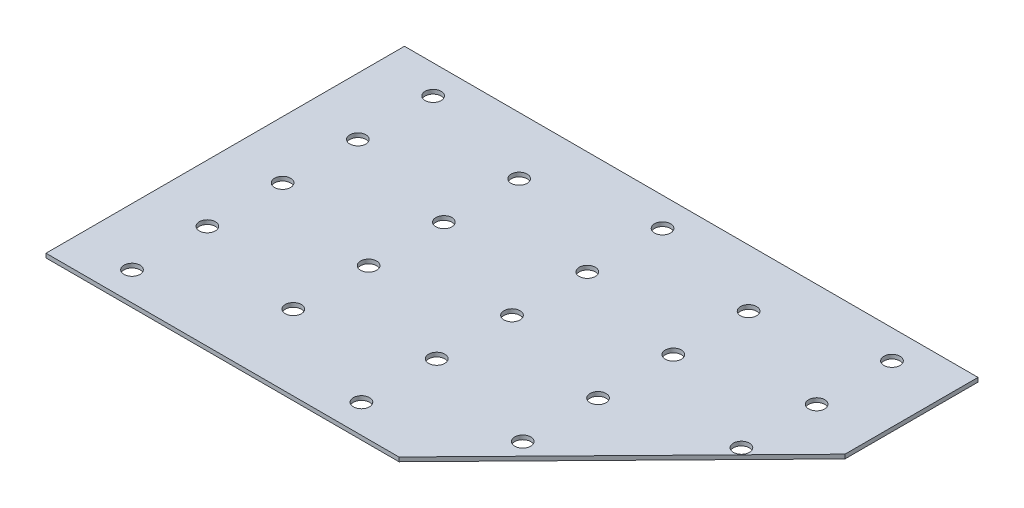
ISO-10303-21;
HEADER;
FILE_DESCRIPTION(('STEP AP214'),'2;1');
FILE_NAME('part.step','',(''),(''),'','','');
FILE_SCHEMA(('AUTOMOTIVE_DESIGN { 1 0 10303 214 1 1 1 1 }'));
ENDSEC;
DATA;
#1=APPLICATION_CONTEXT('core data for automotive mechanical design processes');
#2=APPLICATION_PROTOCOL_DEFINITION('international standard','automotive_design',2000,#1);
#3=PRODUCT_CONTEXT('',#1,'mechanical');
#4=PRODUCT('Part','Part','',(#3));
#5=PRODUCT_RELATED_PRODUCT_CATEGORY('part','',(#4));
#6=PRODUCT_DEFINITION_FORMATION('','',#4);
#7=PRODUCT_DEFINITION_CONTEXT('part definition',#1,'design');
#8=PRODUCT_DEFINITION('design','',#6,#7);
#9=PRODUCT_DEFINITION_SHAPE('','',#8);
#10=(LENGTH_UNIT() NAMED_UNIT(*) SI_UNIT(.MILLI.,.METRE.));
#11=(NAMED_UNIT(*) PLANE_ANGLE_UNIT() SI_UNIT($,.RADIAN.));
#12=(NAMED_UNIT(*) SI_UNIT($,.STERADIAN.) SOLID_ANGLE_UNIT());
#13=UNCERTAINTY_MEASURE_WITH_UNIT(LENGTH_MEASURE(1.E-05),#10,'distance_accuracy_value','');
#14=(GEOMETRIC_REPRESENTATION_CONTEXT(3) GLOBAL_UNCERTAINTY_ASSIGNED_CONTEXT((#13)) GLOBAL_UNIT_ASSIGNED_CONTEXT((#10,
#11,#12)) REPRESENTATION_CONTEXT('',''));
#15=CARTESIAN_POINT('',(0.,0.,0.));
#16=DIRECTION('',(0.,0.,1.));
#17=DIRECTION('',(1.,0.,0.));
#18=AXIS2_PLACEMENT_3D('',#15,#16,#17);
#19=CARTESIAN_POINT('',(0.,0.9144,0.));
#20=DIRECTION('',(0.,1.,0.));
#21=DIRECTION('',(0.,0.,1.));
#22=AXIS2_PLACEMENT_3D('',#19,#20,#21);
#23=PLANE('',#22);
#24=CARTESIAN_POINT('',(-50.8,0.9144,-33.3375));
#25=DIRECTION('',(0.,1.,0.));
#26=DIRECTION('',(0.,0.,1.));
#27=AXIS2_PLACEMENT_3D('',#24,#25,#26);
#28=CIRCLE('',#27,1.778);
#29=CARTESIAN_POINT('',(-50.8,0.9144,-31.5595));
#30=VERTEX_POINT('',#29);
#31=EDGE_CURVE('E150',#30,#30,#28,.F.);
#32=ORIENTED_EDGE('',*,*,#31,.T.);
#33=EDGE_LOOP('',(#32));
#34=FACE_BOUND('',#33,.T.);
#35=CARTESIAN_POINT('',(25.4,0.9144,23.01875));
#36=DIRECTION('',(0.,1.,0.));
#37=DIRECTION('',(0.,0.,1.));
#38=AXIS2_PLACEMENT_3D('',#35,#36,#37);
#39=CIRCLE('',#38,1.778);
#40=CARTESIAN_POINT('',(25.4,0.9144,24.79675));
#41=VERTEX_POINT('',#40);
#42=EDGE_CURVE('E153',#41,#41,#39,.F.);
#43=ORIENTED_EDGE('',*,*,#42,.T.);
#44=EDGE_LOOP('',(#43));
#45=FACE_BOUND('',#44,.T.);
#46=CARTESIAN_POINT('',(-25.4,0.9144,23.01875));
#47=DIRECTION('',(0.,1.,0.));
#48=DIRECTION('',(0.,0.,1.));
#49=AXIS2_PLACEMENT_3D('',#46,#47,#48);
#50=CIRCLE('',#49,1.778);
#51=CARTESIAN_POINT('',(-25.4,0.9144,24.79675));
#52=VERTEX_POINT('',#51);
#53=EDGE_CURVE('E156',#52,#52,#50,.F.);
#54=ORIENTED_EDGE('',*,*,#53,.T.);
#55=EDGE_LOOP('',(#54));
#56=FACE_BOUND('',#55,.T.);
#57=CARTESIAN_POINT('',(25.4,0.9144,6.35));
#58=DIRECTION('',(0.,1.,0.));
#59=DIRECTION('',(0.,0.,1.));
#60=AXIS2_PLACEMENT_3D('',#57,#58,#59);
#61=CIRCLE('',#60,1.778);
#62=CARTESIAN_POINT('',(25.4,0.9144,8.128));
#63=VERTEX_POINT('',#62);
#64=EDGE_CURVE('E159',#63,#63,#61,.F.);
#65=ORIENTED_EDGE('',*,*,#64,.T.);
#66=EDGE_LOOP('',(#65));
#67=FACE_BOUND('',#66,.T.);
#68=CARTESIAN_POINT('',(-25.4,0.9144,6.35));
#69=DIRECTION('',(0.,1.,0.));
#70=DIRECTION('',(0.,0.,1.));
#71=AXIS2_PLACEMENT_3D('',#68,#69,#70);
#72=CIRCLE('',#71,1.778);
#73=CARTESIAN_POINT('',(-25.4,0.9144,8.128));
#74=VERTEX_POINT('',#73);
#75=EDGE_CURVE('E162',#74,#74,#72,.F.);
#76=ORIENTED_EDGE('',*,*,#75,.T.);
#77=EDGE_LOOP('',(#76));
#78=FACE_BOUND('',#77,.T.);
#79=CARTESIAN_POINT('',(25.4,0.9144,-10.31875));
#80=DIRECTION('',(0.,1.,0.));
#81=DIRECTION('',(0.,0.,1.));
#82=AXIS2_PLACEMENT_3D('',#79,#80,#81);
#83=CIRCLE('',#82,1.778);
#84=CARTESIAN_POINT('',(25.4,0.9144,-8.54075));
#85=VERTEX_POINT('',#84);
#86=EDGE_CURVE('E165',#85,#85,#83,.F.);
#87=ORIENTED_EDGE('',*,*,#86,.T.);
#88=EDGE_LOOP('',(#87));
#89=FACE_BOUND('',#88,.T.);
#90=CARTESIAN_POINT('',(-25.4,0.9144,-10.31875));
#91=DIRECTION('',(0.,1.,0.));
#92=DIRECTION('',(0.,0.,1.));
#93=AXIS2_PLACEMENT_3D('',#90,#91,#92);
#94=CIRCLE('',#93,1.778);
#95=CARTESIAN_POINT('',(-25.4,0.9144,-8.54075));
#96=VERTEX_POINT('',#95);
#97=EDGE_CURVE('E168',#96,#96,#94,.F.);
#98=ORIENTED_EDGE('',*,*,#97,.T.);
#99=EDGE_LOOP('',(#98));
#100=FACE_BOUND('',#99,.T.);
#101=CARTESIAN_POINT('',(25.4,0.9144,-26.9875));
#102=DIRECTION('',(0.,1.,0.));
#103=DIRECTION('',(0.,0.,1.));
#104=AXIS2_PLACEMENT_3D('',#101,#102,#103);
#105=CIRCLE('',#104,1.778);
#106=CARTESIAN_POINT('',(25.4,0.9144,-25.2095));
#107=VERTEX_POINT('',#106);
#108=EDGE_CURVE('E171',#107,#107,#105,.F.);
#109=ORIENTED_EDGE('',*,*,#108,.T.);
#110=EDGE_LOOP('',(#109));
#111=FACE_BOUND('',#110,.T.);
#112=CARTESIAN_POINT('',(-25.4,0.9144,-26.9875));
#113=DIRECTION('',(0.,1.,0.));
#114=DIRECTION('',(0.,0.,1.));
#115=AXIS2_PLACEMENT_3D('',#112,#113,#114);
#116=CIRCLE('',#115,1.778);
#117=CARTESIAN_POINT('',(-25.4,0.9144,-25.2095));
#118=VERTEX_POINT('',#117);
#119=EDGE_CURVE('E174',#118,#118,#116,.F.);
#120=ORIENTED_EDGE('',*,*,#119,.T.);
#121=EDGE_LOOP('',(#120));
#122=FACE_BOUND('',#121,.T.);
#123=CARTESIAN_POINT('',(0.,0.9144,33.3375));
#124=DIRECTION('',(0.,1.,0.));
#125=DIRECTION('',(0.,0.,1.));
#126=AXIS2_PLACEMENT_3D('',#123,#124,#125);
#127=CIRCLE('',#126,1.778);
#128=CARTESIAN_POINT('',(0.,0.9144,35.1155));
#129=VERTEX_POINT('',#128);
#130=EDGE_CURVE('E177',#129,#129,#127,.F.);
#131=ORIENTED_EDGE('',*,*,#130,.T.);
#132=EDGE_LOOP('',(#131));
#133=FACE_BOUND('',#132,.T.);
#134=CARTESIAN_POINT('',(-50.8,0.9144,33.3375));
#135=DIRECTION('',(0.,1.,0.));
#136=DIRECTION('',(0.,0.,1.));
#137=AXIS2_PLACEMENT_3D('',#134,#135,#136);
#138=CIRCLE('',#137,1.778);
#139=CARTESIAN_POINT('',(-50.8,0.9144,35.1155));
#140=VERTEX_POINT('',#139);
#141=EDGE_CURVE('E180',#140,#140,#138,.F.);
#142=ORIENTED_EDGE('',*,*,#141,.T.);
#143=EDGE_LOOP('',(#142));
#144=FACE_BOUND('',#143,.T.);
#145=CARTESIAN_POINT('',(0.,0.9144,16.66875));
#146=DIRECTION('',(0.,1.,0.));
#147=DIRECTION('',(0.,0.,1.));
#148=AXIS2_PLACEMENT_3D('',#145,#146,#147);
#149=CIRCLE('',#148,1.778);
#150=CARTESIAN_POINT('',(0.,0.9144,18.44675));
#151=VERTEX_POINT('',#150);
#152=EDGE_CURVE('E183',#151,#151,#149,.F.);
#153=ORIENTED_EDGE('',*,*,#152,.T.);
#154=EDGE_LOOP('',(#153));
#155=FACE_BOUND('',#154,.T.);
#156=CARTESIAN_POINT('',(-50.8,0.9144,16.66875));
#157=DIRECTION('',(0.,1.,0.));
#158=DIRECTION('',(0.,0.,1.));
#159=AXIS2_PLACEMENT_3D('',#156,#157,#158);
#160=CIRCLE('',#159,1.778);
#161=CARTESIAN_POINT('',(-50.8,0.9144,18.44675));
#162=VERTEX_POINT('',#161);
#163=EDGE_CURVE('E186',#162,#162,#160,.F.);
#164=ORIENTED_EDGE('',*,*,#163,.T.);
#165=EDGE_LOOP('',(#164));
#166=FACE_BOUND('',#165,.T.);
#167=CARTESIAN_POINT('',(50.8,0.9144,0.));
#168=DIRECTION('',(0.,1.,0.));
#169=DIRECTION('',(0.,0.,1.));
#170=AXIS2_PLACEMENT_3D('',#167,#168,#169);
#171=CIRCLE('',#170,1.778);
#172=CARTESIAN_POINT('',(50.8,0.9144,1.778));
#173=VERTEX_POINT('',#172);
#174=EDGE_CURVE('E189',#173,#173,#171,.F.);
#175=ORIENTED_EDGE('',*,*,#174,.T.);
#176=EDGE_LOOP('',(#175));
#177=FACE_BOUND('',#176,.T.);
#178=CARTESIAN_POINT('',(0.,0.9144,0.));
#179=DIRECTION('',(0.,1.,0.));
#180=DIRECTION('',(0.,0.,1.));
#181=AXIS2_PLACEMENT_3D('',#178,#179,#180);
#182=CIRCLE('',#181,1.778);
#183=CARTESIAN_POINT('',(0.,0.9144,1.778));
#184=VERTEX_POINT('',#183);
#185=EDGE_CURVE('E192',#184,#184,#182,.F.);
#186=ORIENTED_EDGE('',*,*,#185,.T.);
#187=EDGE_LOOP('',(#186));
#188=FACE_BOUND('',#187,.T.);
#189=CARTESIAN_POINT('',(-50.8,0.9144,0.));
#190=DIRECTION('',(0.,1.,0.));
#191=DIRECTION('',(0.,0.,1.));
#192=AXIS2_PLACEMENT_3D('',#189,#190,#191);
#193=CIRCLE('',#192,1.778);
#194=CARTESIAN_POINT('',(-50.8,0.9144,1.778));
#195=VERTEX_POINT('',#194);
#196=EDGE_CURVE('E195',#195,#195,#193,.F.);
#197=ORIENTED_EDGE('',*,*,#196,.T.);
#198=EDGE_LOOP('',(#197));
#199=FACE_BOUND('',#198,.T.);
#200=CARTESIAN_POINT('',(50.8,0.9144,-16.66875));
#201=DIRECTION('',(0.,1.,0.));
#202=DIRECTION('',(0.,0.,1.));
#203=AXIS2_PLACEMENT_3D('',#200,#201,#202);
#204=CIRCLE('',#203,1.778);
#205=CARTESIAN_POINT('',(50.8,0.9144,-14.89075));
#206=VERTEX_POINT('',#205);
#207=EDGE_CURVE('E198',#206,#206,#204,.F.);
#208=ORIENTED_EDGE('',*,*,#207,.T.);
#209=EDGE_LOOP('',(#208));
#210=FACE_BOUND('',#209,.T.);
#211=CARTESIAN_POINT('',(0.,0.9144,-16.66875));
#212=DIRECTION('',(0.,1.,0.));
#213=DIRECTION('',(0.,0.,1.));
#214=AXIS2_PLACEMENT_3D('',#211,#212,#213);
#215=CIRCLE('',#214,1.778);
#216=CARTESIAN_POINT('',(0.,0.9144,-14.89075));
#217=VERTEX_POINT('',#216);
#218=EDGE_CURVE('E201',#217,#217,#215,.F.);
#219=ORIENTED_EDGE('',*,*,#218,.T.);
#220=EDGE_LOOP('',(#219));
#221=FACE_BOUND('',#220,.T.);
#222=CARTESIAN_POINT('',(-50.8,0.9144,-16.66875));
#223=DIRECTION('',(0.,1.,0.));
#224=DIRECTION('',(0.,0.,1.));
#225=AXIS2_PLACEMENT_3D('',#222,#223,#224);
#226=CIRCLE('',#225,1.778);
#227=CARTESIAN_POINT('',(-50.8,0.9144,-14.89075));
#228=VERTEX_POINT('',#227);
#229=EDGE_CURVE('E204',#228,#228,#226,.F.);
#230=ORIENTED_EDGE('',*,*,#229,.T.);
#231=EDGE_LOOP('',(#230));
#232=FACE_BOUND('',#231,.T.);
#233=CARTESIAN_POINT('',(50.8,0.9144,-33.3375));
#234=DIRECTION('',(0.,1.,0.));
#235=DIRECTION('',(0.,0.,1.));
#236=AXIS2_PLACEMENT_3D('',#233,#234,#235);
#237=CIRCLE('',#236,1.778);
#238=CARTESIAN_POINT('',(50.8,0.9144,-31.5595));
#239=VERTEX_POINT('',#238);
#240=EDGE_CURVE('E206',#239,#239,#237,.F.);
#241=ORIENTED_EDGE('',*,*,#240,.T.);
#242=EDGE_LOOP('',(#241));
#243=FACE_BOUND('',#242,.T.);
#244=CARTESIAN_POINT('',(0.,0.9144,-33.3375));
#245=DIRECTION('',(0.,1.,0.));
#246=DIRECTION('',(0.,0.,1.));
#247=AXIS2_PLACEMENT_3D('',#244,#245,#246);
#248=CIRCLE('',#247,1.778);
#249=CARTESIAN_POINT('',(0.,0.9144,-31.5595));
#250=VERTEX_POINT('',#249);
#251=EDGE_CURVE('E19',#250,#250,#248,.F.);
#252=ORIENTED_EDGE('',*,*,#251,.T.);
#253=EDGE_LOOP('',(#252));
#254=FACE_BOUND('',#253,.T.);
#255=DIRECTION('',(1.,0.,0.));
#256=VECTOR('',#255,1.);
#257=CARTESIAN_POINT('',(-63.5,0.9144,39.6875));
#258=LINE('',#257,#256);
#259=CARTESIAN_POINT('',(14.659600288689,0.9144,39.6875000000005));
#260=VERTEX_POINT('',#259);
#261=CARTESIAN_POINT('',(-63.5,0.9144,39.6875));
#262=VERTEX_POINT('',#261);
#263=EDGE_CURVE('E78',#260,#262,#258,.F.);
#264=ORIENTED_EDGE('',*,*,#263,.F.);
#265=DIRECTION('',(-0.699281733504182,0.,0.714846177290882));
#266=VECTOR('',#265,1.);
#267=CARTESIAN_POINT('',(63.5,0.9144,-10.2399775218734));
#268=LINE('',#267,#266);
#269=CARTESIAN_POINT('',(63.5,0.9144,-10.2399775218734));
#270=VERTEX_POINT('',#269);
#271=EDGE_CURVE('E74',#260,#270,#268,.F.);
#272=ORIENTED_EDGE('',*,*,#271,.T.);
#273=DIRECTION('',(0.,0.,-1.));
#274=VECTOR('',#273,1.);
#275=CARTESIAN_POINT('',(63.5,0.9144,39.6875));
#276=LINE('',#275,#274);
#277=CARTESIAN_POINT('',(63.5,0.9144,-39.6875));
#278=VERTEX_POINT('',#277);
#279=EDGE_CURVE('E65',#278,#270,#276,.F.);
#280=ORIENTED_EDGE('',*,*,#279,.F.);
#281=DIRECTION('',(-1.,0.,0.));
#282=VECTOR('',#281,1.);
#283=CARTESIAN_POINT('',(63.5,0.9144,-39.6875));
#284=LINE('',#283,#282);
#285=CARTESIAN_POINT('',(-63.5,0.9144,-39.6875));
#286=VERTEX_POINT('',#285);
#287=EDGE_CURVE('E60',#286,#278,#284,.F.);
#288=ORIENTED_EDGE('',*,*,#287,.F.);
#289=DIRECTION('',(0.,0.,1.));
#290=VECTOR('',#289,1.);
#291=CARTESIAN_POINT('',(-63.5,0.9144,-39.6875));
#292=LINE('',#291,#290);
#293=EDGE_CURVE('E222',#262,#286,#292,.F.);
#294=ORIENTED_EDGE('',*,*,#293,.F.);
#295=EDGE_LOOP('',(#264,#272,#280,#288,#294));
#296=FACE_BOUND('',#295,.T.);
#297=ADVANCED_FACE('F16',(#34,#45,#56,#67,#78,#89,#100,#111,#122,#133,#144,#155,#166,#177,#188,
#199,#210,#221,#232,#243,#254,#296),#23,.T.);
#298=CARTESIAN_POINT('',(63.5,0.9144,-10.2399775218734));
#299=DIRECTION('',(-0.714846177290882,0.,-0.699281733504182));
#300=DIRECTION('',(-0.699281733504182,0.,0.714846177290882));
#301=AXIS2_PLACEMENT_3D('',#298,#299,#300);
#302=PLANE('',#301);
#303=ORIENTED_EDGE('',*,*,#271,.F.);
#304=DIRECTION('',(0.,1.,0.));
#305=VECTOR('',#304,1.);
#306=CARTESIAN_POINT('',(14.6596002886885,0.,39.6875));
#307=LINE('',#306,#305);
#308=CARTESIAN_POINT('',(14.6596002886895,0.,39.6875000000011));
#309=VERTEX_POINT('',#308);
#310=EDGE_CURVE('E211',#309,#260,#307,.T.);
#311=ORIENTED_EDGE('',*,*,#310,.F.);
#312=DIRECTION('',(0.699281733504213,0.,-0.714846177290851));
#313=VECTOR('',#312,1.);
#314=CARTESIAN_POINT('',(14.6596002886885,0.,39.6875));
#315=LINE('',#314,#313);
#316=CARTESIAN_POINT('',(63.5,0.,-10.2399775218734));
#317=VERTEX_POINT('',#316);
#318=EDGE_CURVE('E85',#309,#317,#315,.T.);
#319=ORIENTED_EDGE('',*,*,#318,.T.);
#320=DIRECTION('',(0.,1.,0.));
#321=VECTOR('',#320,1.);
#322=CARTESIAN_POINT('',(63.5,0.,-10.2399775218734));
#323=LINE('',#322,#321);
#324=EDGE_CURVE('E70',#270,#317,#323,.F.);
#325=ORIENTED_EDGE('',*,*,#324,.F.);
#326=EDGE_LOOP('',(#303,#311,#319,#325));
#327=FACE_BOUND('',#326,.T.);
#328=ADVANCED_FACE('F84',(#327),#302,.F.);
#329=CARTESIAN_POINT('',(63.5,0.,39.6875));
#330=DIRECTION('',(1.,0.,0.));
#331=DIRECTION('',(0.,0.,-1.));
#332=AXIS2_PLACEMENT_3D('',#329,#330,#331);
#333=PLANE('',#332);
#334=ORIENTED_EDGE('',*,*,#279,.T.);
#335=ORIENTED_EDGE('',*,*,#324,.T.);
#336=DIRECTION('',(0.,0.,1.));
#337=VECTOR('',#336,1.);
#338=CARTESIAN_POINT('',(63.5,0.,0.));
#339=LINE('',#338,#337);
#340=CARTESIAN_POINT('',(63.5,0.,-39.6875));
#341=VERTEX_POINT('',#340);
#342=EDGE_CURVE('E230',#317,#341,#339,.F.);
#343=ORIENTED_EDGE('',*,*,#342,.T.);
#344=DIRECTION('',(0.,1.,0.));
#345=VECTOR('',#344,1.);
#346=CARTESIAN_POINT('',(63.5,0.,-39.6875));
#347=LINE('',#346,#345);
#348=EDGE_CURVE('E72',#278,#341,#347,.F.);
#349=ORIENTED_EDGE('',*,*,#348,.F.);
#350=EDGE_LOOP('',(#334,#335,#343,#349));
#351=FACE_BOUND('',#350,.T.);
#352=ADVANCED_FACE('F67',(#351),#333,.T.);
#353=CARTESIAN_POINT('',(63.5,0.,-39.6875));
#354=DIRECTION('',(0.,0.,-1.));
#355=DIRECTION('',(-1.,0.,0.));
#356=AXIS2_PLACEMENT_3D('',#353,#354,#355);
#357=PLANE('',#356);
#358=ORIENTED_EDGE('',*,*,#348,.T.);
#359=DIRECTION('',(1.,0.,0.));
#360=VECTOR('',#359,1.);
#361=CARTESIAN_POINT('',(0.,0.,-39.6875));
#362=LINE('',#361,#360);
#363=CARTESIAN_POINT('',(-63.5,0.,-39.6875));
#364=VERTEX_POINT('',#363);
#365=EDGE_CURVE('E226',#341,#364,#362,.F.);
#366=ORIENTED_EDGE('',*,*,#365,.T.);
#367=DIRECTION('',(0.,1.,0.));
#368=VECTOR('',#367,1.);
#369=CARTESIAN_POINT('',(-63.5,0.,-39.6875));
#370=LINE('',#369,#368);
#371=EDGE_CURVE('E220',#286,#364,#370,.F.);
#372=ORIENTED_EDGE('',*,*,#371,.F.);
#373=ORIENTED_EDGE('',*,*,#287,.T.);
#374=EDGE_LOOP('',(#358,#366,#372,#373));
#375=FACE_BOUND('',#374,.T.);
#376=ADVANCED_FACE('F225',(#375),#357,.T.);
#377=CARTESIAN_POINT('',(-63.5,0.,-39.6875));
#378=DIRECTION('',(-1.,0.,0.));
#379=DIRECTION('',(0.,0.,1.));
#380=AXIS2_PLACEMENT_3D('',#377,#378,#379);
#381=PLANE('',#380);
#382=ORIENTED_EDGE('',*,*,#371,.T.);
#383=DIRECTION('',(0.,0.,1.));
#384=VECTOR('',#383,1.);
#385=CARTESIAN_POINT('',(-63.5,0.,0.));
#386=LINE('',#385,#384);
#387=CARTESIAN_POINT('',(-63.5,0.,39.6875));
#388=VERTEX_POINT('',#387);
#389=EDGE_CURVE('E232',#364,#388,#386,.T.);
#390=ORIENTED_EDGE('',*,*,#389,.T.);
#391=DIRECTION('',(0.,1.,0.));
#392=VECTOR('',#391,1.);
#393=CARTESIAN_POINT('',(-63.5,0.,39.6875));
#394=LINE('',#393,#392);
#395=EDGE_CURVE('E34',#262,#388,#394,.F.);
#396=ORIENTED_EDGE('',*,*,#395,.F.);
#397=ORIENTED_EDGE('',*,*,#293,.T.);
#398=EDGE_LOOP('',(#382,#390,#396,#397));
#399=FACE_BOUND('',#398,.T.);
#400=ADVANCED_FACE('F238',(#399),#381,.T.);
#401=CARTESIAN_POINT('',(-63.5,0.,39.6875));
#402=DIRECTION('',(0.,0.,1.));
#403=DIRECTION('',(1.,0.,0.));
#404=AXIS2_PLACEMENT_3D('',#401,#402,#403);
#405=PLANE('',#404);
#406=DIRECTION('',(1.,0.,0.));
#407=VECTOR('',#406,1.);
#408=CARTESIAN_POINT('',(0.,0.,39.6875));
#409=LINE('',#408,#407);
#410=EDGE_CURVE('E149',#388,#309,#409,.T.);
#411=ORIENTED_EDGE('',*,*,#410,.T.);
#412=ORIENTED_EDGE('',*,*,#310,.T.);
#413=ORIENTED_EDGE('',*,*,#263,.T.);
#414=ORIENTED_EDGE('',*,*,#395,.T.);
#415=EDGE_LOOP('',(#411,#412,#413,#414));
#416=FACE_BOUND('',#415,.T.);
#417=ADVANCED_FACE('F236',(#416),#405,.T.);
#418=CARTESIAN_POINT('',(0.,0.9144,-33.3375));
#419=DIRECTION('',(0.,1.,0.));
#420=DIRECTION('',(0.,0.,1.));
#421=AXIS2_PLACEMENT_3D('',#418,#419,#420);
#422=CYLINDRICAL_SURFACE('',#421,1.778);
#423=ORIENTED_EDGE('',*,*,#251,.F.);
#424=EDGE_LOOP('',(#423));
#425=FACE_BOUND('',#424,.T.);
#426=CARTESIAN_POINT('',(0.,0.,-33.3375));
#427=DIRECTION('',(0.,1.,0.));
#428=DIRECTION('',(0.,0.,1.));
#429=AXIS2_PLACEMENT_3D('',#426,#427,#428);
#430=CIRCLE('',#429,1.778);
#431=CARTESIAN_POINT('',(0.,0.,-31.5595));
#432=VERTEX_POINT('',#431);
#433=EDGE_CURVE('E146',#432,#432,#430,.F.);
#434=ORIENTED_EDGE('',*,*,#433,.T.);
#435=EDGE_LOOP('',(#434));
#436=FACE_BOUND('',#435,.T.);
#437=ADVANCED_FACE('F246',(#425,#436),#422,.F.);
#438=CARTESIAN_POINT('',(50.8,0.9144,-33.3375));
#439=DIRECTION('',(0.,1.,0.));
#440=DIRECTION('',(0.,0.,1.));
#441=AXIS2_PLACEMENT_3D('',#438,#439,#440);
#442=CYLINDRICAL_SURFACE('',#441,1.778);
#443=ORIENTED_EDGE('',*,*,#240,.F.);
#444=EDGE_LOOP('',(#443));
#445=FACE_BOUND('',#444,.T.);
#446=CARTESIAN_POINT('',(50.8,0.,-33.3375));
#447=DIRECTION('',(0.,1.,0.));
#448=DIRECTION('',(0.,0.,1.));
#449=AXIS2_PLACEMENT_3D('',#446,#447,#448);
#450=CIRCLE('',#449,1.778);
#451=CARTESIAN_POINT('',(50.8,0.,-31.5595));
#452=VERTEX_POINT('',#451);
#453=EDGE_CURVE('E143',#452,#452,#450,.F.);
#454=ORIENTED_EDGE('',*,*,#453,.T.);
#455=EDGE_LOOP('',(#454));
#456=FACE_BOUND('',#455,.T.);
#457=ADVANCED_FACE('F332',(#445,#456),#442,.F.);
#458=CARTESIAN_POINT('',(-50.8,0.9144,-16.66875));
#459=DIRECTION('',(0.,1.,0.));
#460=DIRECTION('',(0.,0.,1.));
#461=AXIS2_PLACEMENT_3D('',#458,#459,#460);
#462=CYLINDRICAL_SURFACE('',#461,1.778);
#463=ORIENTED_EDGE('',*,*,#229,.F.);
#464=EDGE_LOOP('',(#463));
#465=FACE_BOUND('',#464,.T.);
#466=CARTESIAN_POINT('',(-50.8,0.,-16.66875));
#467=DIRECTION('',(0.,1.,0.));
#468=DIRECTION('',(0.,0.,1.));
#469=AXIS2_PLACEMENT_3D('',#466,#467,#468);
#470=CIRCLE('',#469,1.778);
#471=CARTESIAN_POINT('',(-50.8,0.,-14.89075));
#472=VERTEX_POINT('',#471);
#473=EDGE_CURVE('E140',#472,#472,#470,.F.);
#474=ORIENTED_EDGE('',*,*,#473,.T.);
#475=EDGE_LOOP('',(#474));
#476=FACE_BOUND('',#475,.T.);
#477=ADVANCED_FACE('F328',(#465,#476),#462,.F.);
#478=CARTESIAN_POINT('',(0.,0.9144,-16.66875));
#479=DIRECTION('',(0.,1.,0.));
#480=DIRECTION('',(0.,0.,1.));
#481=AXIS2_PLACEMENT_3D('',#478,#479,#480);
#482=CYLINDRICAL_SURFACE('',#481,1.778);
#483=ORIENTED_EDGE('',*,*,#218,.F.);
#484=EDGE_LOOP('',(#483));
#485=FACE_BOUND('',#484,.T.);
#486=CARTESIAN_POINT('',(0.,0.,-16.66875));
#487=DIRECTION('',(0.,1.,0.));
#488=DIRECTION('',(0.,0.,1.));
#489=AXIS2_PLACEMENT_3D('',#486,#487,#488);
#490=CIRCLE('',#489,1.778);
#491=CARTESIAN_POINT('',(0.,0.,-14.89075));
#492=VERTEX_POINT('',#491);
#493=EDGE_CURVE('E137',#492,#492,#490,.F.);
#494=ORIENTED_EDGE('',*,*,#493,.T.);
#495=EDGE_LOOP('',(#494));
#496=FACE_BOUND('',#495,.T.);
#497=ADVANCED_FACE('F324',(#485,#496),#482,.F.);
#498=CARTESIAN_POINT('',(50.8,0.9144,-16.66875));
#499=DIRECTION('',(0.,1.,0.));
#500=DIRECTION('',(0.,0.,1.));
#501=AXIS2_PLACEMENT_3D('',#498,#499,#500);
#502=CYLINDRICAL_SURFACE('',#501,1.778);
#503=ORIENTED_EDGE('',*,*,#207,.F.);
#504=EDGE_LOOP('',(#503));
#505=FACE_BOUND('',#504,.T.);
#506=CARTESIAN_POINT('',(50.8,0.,-16.66875));
#507=DIRECTION('',(0.,1.,0.));
#508=DIRECTION('',(0.,0.,1.));
#509=AXIS2_PLACEMENT_3D('',#506,#507,#508);
#510=CIRCLE('',#509,1.778);
#511=CARTESIAN_POINT('',(50.8,0.,-14.89075));
#512=VERTEX_POINT('',#511);
#513=EDGE_CURVE('E134',#512,#512,#510,.F.);
#514=ORIENTED_EDGE('',*,*,#513,.T.);
#515=EDGE_LOOP('',(#514));
#516=FACE_BOUND('',#515,.T.);
#517=ADVANCED_FACE('F320',(#505,#516),#502,.F.);
#518=CARTESIAN_POINT('',(-50.8,0.9144,0.));
#519=DIRECTION('',(0.,1.,0.));
#520=DIRECTION('',(0.,0.,1.));
#521=AXIS2_PLACEMENT_3D('',#518,#519,#520);
#522=CYLINDRICAL_SURFACE('',#521,1.778);
#523=ORIENTED_EDGE('',*,*,#196,.F.);
#524=EDGE_LOOP('',(#523));
#525=FACE_BOUND('',#524,.T.);
#526=CARTESIAN_POINT('',(-50.8,0.,0.));
#527=DIRECTION('',(0.,1.,0.));
#528=DIRECTION('',(0.,0.,1.));
#529=AXIS2_PLACEMENT_3D('',#526,#527,#528);
#530=CIRCLE('',#529,1.778);
#531=CARTESIAN_POINT('',(-50.8,0.,1.778));
#532=VERTEX_POINT('',#531);
#533=EDGE_CURVE('E131',#532,#532,#530,.F.);
#534=ORIENTED_EDGE('',*,*,#533,.T.);
#535=EDGE_LOOP('',(#534));
#536=FACE_BOUND('',#535,.T.);
#537=ADVANCED_FACE('F316',(#525,#536),#522,.F.);
#538=CARTESIAN_POINT('',(0.,0.9144,0.));
#539=DIRECTION('',(0.,1.,0.));
#540=DIRECTION('',(0.,0.,1.));
#541=AXIS2_PLACEMENT_3D('',#538,#539,#540);
#542=CYLINDRICAL_SURFACE('',#541,1.778);
#543=ORIENTED_EDGE('',*,*,#185,.F.);
#544=EDGE_LOOP('',(#543));
#545=FACE_BOUND('',#544,.T.);
#546=CARTESIAN_POINT('',(0.,0.,0.));
#547=DIRECTION('',(0.,1.,0.));
#548=DIRECTION('',(0.,0.,1.));
#549=AXIS2_PLACEMENT_3D('',#546,#547,#548);
#550=CIRCLE('',#549,1.778);
#551=CARTESIAN_POINT('',(0.,0.,1.778));
#552=VERTEX_POINT('',#551);
#553=EDGE_CURVE('E128',#552,#552,#550,.F.);
#554=ORIENTED_EDGE('',*,*,#553,.T.);
#555=EDGE_LOOP('',(#554));
#556=FACE_BOUND('',#555,.T.);
#557=ADVANCED_FACE('F312',(#545,#556),#542,.F.);
#558=CARTESIAN_POINT('',(50.8,0.9144,0.));
#559=DIRECTION('',(0.,1.,0.));
#560=DIRECTION('',(0.,0.,1.));
#561=AXIS2_PLACEMENT_3D('',#558,#559,#560);
#562=CYLINDRICAL_SURFACE('',#561,1.778);
#563=ORIENTED_EDGE('',*,*,#174,.F.);
#564=EDGE_LOOP('',(#563));
#565=FACE_BOUND('',#564,.T.);
#566=CARTESIAN_POINT('',(50.8,0.,0.));
#567=DIRECTION('',(0.,1.,0.));
#568=DIRECTION('',(0.,0.,1.));
#569=AXIS2_PLACEMENT_3D('',#566,#567,#568);
#570=CIRCLE('',#569,1.778);
#571=CARTESIAN_POINT('',(50.8,0.,1.778));
#572=VERTEX_POINT('',#571);
#573=EDGE_CURVE('E125',#572,#572,#570,.F.);
#574=ORIENTED_EDGE('',*,*,#573,.T.);
#575=EDGE_LOOP('',(#574));
#576=FACE_BOUND('',#575,.T.);
#577=ADVANCED_FACE('F308',(#565,#576),#562,.F.);
#578=CARTESIAN_POINT('',(-50.8,0.9144,16.66875));
#579=DIRECTION('',(0.,1.,0.));
#580=DIRECTION('',(0.,0.,1.));
#581=AXIS2_PLACEMENT_3D('',#578,#579,#580);
#582=CYLINDRICAL_SURFACE('',#581,1.778);
#583=ORIENTED_EDGE('',*,*,#163,.F.);
#584=EDGE_LOOP('',(#583));
#585=FACE_BOUND('',#584,.T.);
#586=CARTESIAN_POINT('',(-50.8,0.,16.66875));
#587=DIRECTION('',(0.,1.,0.));
#588=DIRECTION('',(0.,0.,1.));
#589=AXIS2_PLACEMENT_3D('',#586,#587,#588);
#590=CIRCLE('',#589,1.778);
#591=CARTESIAN_POINT('',(-50.8,0.,18.44675));
#592=VERTEX_POINT('',#591);
#593=EDGE_CURVE('E122',#592,#592,#590,.F.);
#594=ORIENTED_EDGE('',*,*,#593,.T.);
#595=EDGE_LOOP('',(#594));
#596=FACE_BOUND('',#595,.T.);
#597=ADVANCED_FACE('F304',(#585,#596),#582,.F.);
#598=CARTESIAN_POINT('',(0.,0.9144,16.66875));
#599=DIRECTION('',(0.,1.,0.));
#600=DIRECTION('',(0.,0.,1.));
#601=AXIS2_PLACEMENT_3D('',#598,#599,#600);
#602=CYLINDRICAL_SURFACE('',#601,1.778);
#603=ORIENTED_EDGE('',*,*,#152,.F.);
#604=EDGE_LOOP('',(#603));
#605=FACE_BOUND('',#604,.T.);
#606=CARTESIAN_POINT('',(0.,0.,16.66875));
#607=DIRECTION('',(0.,1.,0.));
#608=DIRECTION('',(0.,0.,1.));
#609=AXIS2_PLACEMENT_3D('',#606,#607,#608);
#610=CIRCLE('',#609,1.778);
#611=CARTESIAN_POINT('',(0.,0.,18.44675));
#612=VERTEX_POINT('',#611);
#613=EDGE_CURVE('E119',#612,#612,#610,.F.);
#614=ORIENTED_EDGE('',*,*,#613,.T.);
#615=EDGE_LOOP('',(#614));
#616=FACE_BOUND('',#615,.T.);
#617=ADVANCED_FACE('F300',(#605,#616),#602,.F.);
#618=CARTESIAN_POINT('',(-50.8,0.9144,33.3375));
#619=DIRECTION('',(0.,1.,0.));
#620=DIRECTION('',(0.,0.,1.));
#621=AXIS2_PLACEMENT_3D('',#618,#619,#620);
#622=CYLINDRICAL_SURFACE('',#621,1.778);
#623=ORIENTED_EDGE('',*,*,#141,.F.);
#624=EDGE_LOOP('',(#623));
#625=FACE_BOUND('',#624,.T.);
#626=CARTESIAN_POINT('',(-50.8,0.,33.3375));
#627=DIRECTION('',(0.,1.,0.));
#628=DIRECTION('',(0.,0.,1.));
#629=AXIS2_PLACEMENT_3D('',#626,#627,#628);
#630=CIRCLE('',#629,1.778);
#631=CARTESIAN_POINT('',(-50.8,0.,35.1155));
#632=VERTEX_POINT('',#631);
#633=EDGE_CURVE('E116',#632,#632,#630,.F.);
#634=ORIENTED_EDGE('',*,*,#633,.T.);
#635=EDGE_LOOP('',(#634));
#636=FACE_BOUND('',#635,.T.);
#637=ADVANCED_FACE('F296',(#625,#636),#622,.F.);
#638=CARTESIAN_POINT('',(0.,0.9144,33.3375));
#639=DIRECTION('',(0.,1.,0.));
#640=DIRECTION('',(0.,0.,1.));
#641=AXIS2_PLACEMENT_3D('',#638,#639,#640);
#642=CYLINDRICAL_SURFACE('',#641,1.778);
#643=ORIENTED_EDGE('',*,*,#130,.F.);
#644=EDGE_LOOP('',(#643));
#645=FACE_BOUND('',#644,.T.);
#646=CARTESIAN_POINT('',(0.,0.,33.3375));
#647=DIRECTION('',(0.,1.,0.));
#648=DIRECTION('',(0.,0.,1.));
#649=AXIS2_PLACEMENT_3D('',#646,#647,#648);
#650=CIRCLE('',#649,1.778);
#651=CARTESIAN_POINT('',(0.,0.,35.1155));
#652=VERTEX_POINT('',#651);
#653=EDGE_CURVE('E113',#652,#652,#650,.F.);
#654=ORIENTED_EDGE('',*,*,#653,.T.);
#655=EDGE_LOOP('',(#654));
#656=FACE_BOUND('',#655,.T.);
#657=ADVANCED_FACE('F292',(#645,#656),#642,.F.);
#658=CARTESIAN_POINT('',(-25.4,0.9144,-26.9875));
#659=DIRECTION('',(0.,1.,0.));
#660=DIRECTION('',(0.,0.,1.));
#661=AXIS2_PLACEMENT_3D('',#658,#659,#660);
#662=CYLINDRICAL_SURFACE('',#661,1.778);
#663=ORIENTED_EDGE('',*,*,#119,.F.);
#664=EDGE_LOOP('',(#663));
#665=FACE_BOUND('',#664,.T.);
#666=CARTESIAN_POINT('',(-25.4,0.,-26.9875));
#667=DIRECTION('',(0.,1.,0.));
#668=DIRECTION('',(0.,0.,1.));
#669=AXIS2_PLACEMENT_3D('',#666,#667,#668);
#670=CIRCLE('',#669,1.778);
#671=CARTESIAN_POINT('',(-25.4,0.,-25.2095));
#672=VERTEX_POINT('',#671);
#673=EDGE_CURVE('E110',#672,#672,#670,.F.);
#674=ORIENTED_EDGE('',*,*,#673,.T.);
#675=EDGE_LOOP('',(#674));
#676=FACE_BOUND('',#675,.T.);
#677=ADVANCED_FACE('F288',(#665,#676),#662,.F.);
#678=CARTESIAN_POINT('',(25.4,0.9144,-26.9875));
#679=DIRECTION('',(0.,1.,0.));
#680=DIRECTION('',(0.,0.,1.));
#681=AXIS2_PLACEMENT_3D('',#678,#679,#680);
#682=CYLINDRICAL_SURFACE('',#681,1.778);
#683=ORIENTED_EDGE('',*,*,#108,.F.);
#684=EDGE_LOOP('',(#683));
#685=FACE_BOUND('',#684,.T.);
#686=CARTESIAN_POINT('',(25.4,0.,-26.9875));
#687=DIRECTION('',(0.,1.,0.));
#688=DIRECTION('',(0.,0.,1.));
#689=AXIS2_PLACEMENT_3D('',#686,#687,#688);
#690=CIRCLE('',#689,1.778);
#691=CARTESIAN_POINT('',(25.4,0.,-25.2095));
#692=VERTEX_POINT('',#691);
#693=EDGE_CURVE('E107',#692,#692,#690,.F.);
#694=ORIENTED_EDGE('',*,*,#693,.T.);
#695=EDGE_LOOP('',(#694));
#696=FACE_BOUND('',#695,.T.);
#697=ADVANCED_FACE('F284',(#685,#696),#682,.F.);
#698=CARTESIAN_POINT('',(-25.4,0.9144,-10.31875));
#699=DIRECTION('',(0.,1.,0.));
#700=DIRECTION('',(0.,0.,1.));
#701=AXIS2_PLACEMENT_3D('',#698,#699,#700);
#702=CYLINDRICAL_SURFACE('',#701,1.778);
#703=ORIENTED_EDGE('',*,*,#97,.F.);
#704=EDGE_LOOP('',(#703));
#705=FACE_BOUND('',#704,.T.);
#706=CARTESIAN_POINT('',(-25.4,0.,-10.31875));
#707=DIRECTION('',(0.,1.,0.));
#708=DIRECTION('',(0.,0.,1.));
#709=AXIS2_PLACEMENT_3D('',#706,#707,#708);
#710=CIRCLE('',#709,1.778);
#711=CARTESIAN_POINT('',(-25.4,0.,-8.54075));
#712=VERTEX_POINT('',#711);
#713=EDGE_CURVE('E104',#712,#712,#710,.F.);
#714=ORIENTED_EDGE('',*,*,#713,.T.);
#715=EDGE_LOOP('',(#714));
#716=FACE_BOUND('',#715,.T.);
#717=ADVANCED_FACE('F280',(#705,#716),#702,.F.);
#718=CARTESIAN_POINT('',(25.4,0.9144,-10.31875));
#719=DIRECTION('',(0.,1.,0.));
#720=DIRECTION('',(0.,0.,1.));
#721=AXIS2_PLACEMENT_3D('',#718,#719,#720);
#722=CYLINDRICAL_SURFACE('',#721,1.778);
#723=ORIENTED_EDGE('',*,*,#86,.F.);
#724=EDGE_LOOP('',(#723));
#725=FACE_BOUND('',#724,.T.);
#726=CARTESIAN_POINT('',(25.4,0.,-10.31875));
#727=DIRECTION('',(0.,1.,0.));
#728=DIRECTION('',(0.,0.,1.));
#729=AXIS2_PLACEMENT_3D('',#726,#727,#728);
#730=CIRCLE('',#729,1.778);
#731=CARTESIAN_POINT('',(25.4,0.,-8.54075));
#732=VERTEX_POINT('',#731);
#733=EDGE_CURVE('E101',#732,#732,#730,.F.);
#734=ORIENTED_EDGE('',*,*,#733,.T.);
#735=EDGE_LOOP('',(#734));
#736=FACE_BOUND('',#735,.T.);
#737=ADVANCED_FACE('F276',(#725,#736),#722,.F.);
#738=CARTESIAN_POINT('',(-25.4,0.9144,6.35));
#739=DIRECTION('',(0.,1.,0.));
#740=DIRECTION('',(0.,0.,1.));
#741=AXIS2_PLACEMENT_3D('',#738,#739,#740);
#742=CYLINDRICAL_SURFACE('',#741,1.778);
#743=ORIENTED_EDGE('',*,*,#75,.F.);
#744=EDGE_LOOP('',(#743));
#745=FACE_BOUND('',#744,.T.);
#746=CARTESIAN_POINT('',(-25.4,0.,6.35));
#747=DIRECTION('',(0.,1.,0.));
#748=DIRECTION('',(0.,0.,1.));
#749=AXIS2_PLACEMENT_3D('',#746,#747,#748);
#750=CIRCLE('',#749,1.778);
#751=CARTESIAN_POINT('',(-25.4,0.,8.128));
#752=VERTEX_POINT('',#751);
#753=EDGE_CURVE('E98',#752,#752,#750,.F.);
#754=ORIENTED_EDGE('',*,*,#753,.T.);
#755=EDGE_LOOP('',(#754));
#756=FACE_BOUND('',#755,.T.);
#757=ADVANCED_FACE('F272',(#745,#756),#742,.F.);
#758=CARTESIAN_POINT('',(25.4,0.9144,6.35));
#759=DIRECTION('',(0.,1.,0.));
#760=DIRECTION('',(0.,0.,1.));
#761=AXIS2_PLACEMENT_3D('',#758,#759,#760);
#762=CYLINDRICAL_SURFACE('',#761,1.778);
#763=ORIENTED_EDGE('',*,*,#64,.F.);
#764=EDGE_LOOP('',(#763));
#765=FACE_BOUND('',#764,.T.);
#766=CARTESIAN_POINT('',(25.4,0.,6.35));
#767=DIRECTION('',(0.,1.,0.));
#768=DIRECTION('',(0.,0.,1.));
#769=AXIS2_PLACEMENT_3D('',#766,#767,#768);
#770=CIRCLE('',#769,1.778);
#771=CARTESIAN_POINT('',(25.4,0.,8.128));
#772=VERTEX_POINT('',#771);
#773=EDGE_CURVE('E95',#772,#772,#770,.F.);
#774=ORIENTED_EDGE('',*,*,#773,.T.);
#775=EDGE_LOOP('',(#774));
#776=FACE_BOUND('',#775,.T.);
#777=ADVANCED_FACE('F268',(#765,#776),#762,.F.);
#778=CARTESIAN_POINT('',(-25.4,0.9144,23.01875));
#779=DIRECTION('',(0.,1.,0.));
#780=DIRECTION('',(0.,0.,1.));
#781=AXIS2_PLACEMENT_3D('',#778,#779,#780);
#782=CYLINDRICAL_SURFACE('',#781,1.778);
#783=ORIENTED_EDGE('',*,*,#53,.F.);
#784=EDGE_LOOP('',(#783));
#785=FACE_BOUND('',#784,.T.);
#786=CARTESIAN_POINT('',(-25.4,0.,23.01875));
#787=DIRECTION('',(0.,1.,0.));
#788=DIRECTION('',(0.,0.,1.));
#789=AXIS2_PLACEMENT_3D('',#786,#787,#788);
#790=CIRCLE('',#789,1.778);
#791=CARTESIAN_POINT('',(-25.4,0.,24.79675));
#792=VERTEX_POINT('',#791);
#793=EDGE_CURVE('E92',#792,#792,#790,.F.);
#794=ORIENTED_EDGE('',*,*,#793,.T.);
#795=EDGE_LOOP('',(#794));
#796=FACE_BOUND('',#795,.T.);
#797=ADVANCED_FACE('F264',(#785,#796),#782,.F.);
#798=CARTESIAN_POINT('',(25.4,0.9144,23.01875));
#799=DIRECTION('',(0.,1.,0.));
#800=DIRECTION('',(0.,0.,1.));
#801=AXIS2_PLACEMENT_3D('',#798,#799,#800);
#802=CYLINDRICAL_SURFACE('',#801,1.778);
#803=ORIENTED_EDGE('',*,*,#42,.F.);
#804=EDGE_LOOP('',(#803));
#805=FACE_BOUND('',#804,.T.);
#806=CARTESIAN_POINT('',(25.4,0.,23.01875));
#807=DIRECTION('',(0.,1.,0.));
#808=DIRECTION('',(0.,0.,1.));
#809=AXIS2_PLACEMENT_3D('',#806,#807,#808);
#810=CIRCLE('',#809,1.778);
#811=CARTESIAN_POINT('',(25.4,0.,24.79675));
#812=VERTEX_POINT('',#811);
#813=EDGE_CURVE('E25',#812,#812,#810,.F.);
#814=ORIENTED_EDGE('',*,*,#813,.T.);
#815=EDGE_LOOP('',(#814));
#816=FACE_BOUND('',#815,.T.);
#817=ADVANCED_FACE('F256',(#805,#816),#802,.F.);
#818=CARTESIAN_POINT('',(-50.8,0.9144,-33.3375));
#819=DIRECTION('',(0.,1.,0.));
#820=DIRECTION('',(0.,0.,1.));
#821=AXIS2_PLACEMENT_3D('',#818,#819,#820);
#822=CYLINDRICAL_SURFACE('',#821,1.778);
#823=ORIENTED_EDGE('',*,*,#31,.F.);
#824=EDGE_LOOP('',(#823));
#825=FACE_BOUND('',#824,.T.);
#826=CARTESIAN_POINT('',(-50.8,0.,-33.3375));
#827=DIRECTION('',(0.,1.,0.));
#828=DIRECTION('',(0.,0.,1.));
#829=AXIS2_PLACEMENT_3D('',#826,#827,#828);
#830=CIRCLE('',#829,1.778);
#831=CARTESIAN_POINT('',(-50.8,0.,-31.5595));
#832=VERTEX_POINT('',#831);
#833=EDGE_CURVE('E11',#832,#832,#830,.F.);
#834=ORIENTED_EDGE('',*,*,#833,.T.);
#835=EDGE_LOOP('',(#834));
#836=FACE_BOUND('',#835,.T.);
#837=ADVANCED_FACE('F250',(#825,#836),#822,.F.);
#838=CARTESIAN_POINT('',(0.,0.,0.));
#839=DIRECTION('',(0.,1.,0.));
#840=DIRECTION('',(0.,0.,1.));
#841=AXIS2_PLACEMENT_3D('',#838,#839,#840);
#842=PLANE('',#841);
#843=ORIENTED_EDGE('',*,*,#833,.F.);
#844=EDGE_LOOP('',(#843));
#845=FACE_BOUND('',#844,.T.);
#846=ORIENTED_EDGE('',*,*,#813,.F.);
#847=EDGE_LOOP('',(#846));
#848=FACE_BOUND('',#847,.T.);
#849=ORIENTED_EDGE('',*,*,#793,.F.);
#850=EDGE_LOOP('',(#849));
#851=FACE_BOUND('',#850,.T.);
#852=ORIENTED_EDGE('',*,*,#773,.F.);
#853=EDGE_LOOP('',(#852));
#854=FACE_BOUND('',#853,.T.);
#855=ORIENTED_EDGE('',*,*,#753,.F.);
#856=EDGE_LOOP('',(#855));
#857=FACE_BOUND('',#856,.T.);
#858=ORIENTED_EDGE('',*,*,#733,.F.);
#859=EDGE_LOOP('',(#858));
#860=FACE_BOUND('',#859,.T.);
#861=ORIENTED_EDGE('',*,*,#713,.F.);
#862=EDGE_LOOP('',(#861));
#863=FACE_BOUND('',#862,.T.);
#864=ORIENTED_EDGE('',*,*,#693,.F.);
#865=EDGE_LOOP('',(#864));
#866=FACE_BOUND('',#865,.T.);
#867=ORIENTED_EDGE('',*,*,#673,.F.);
#868=EDGE_LOOP('',(#867));
#869=FACE_BOUND('',#868,.T.);
#870=ORIENTED_EDGE('',*,*,#653,.F.);
#871=EDGE_LOOP('',(#870));
#872=FACE_BOUND('',#871,.T.);
#873=ORIENTED_EDGE('',*,*,#633,.F.);
#874=EDGE_LOOP('',(#873));
#875=FACE_BOUND('',#874,.T.);
#876=ORIENTED_EDGE('',*,*,#613,.F.);
#877=EDGE_LOOP('',(#876));
#878=FACE_BOUND('',#877,.T.);
#879=ORIENTED_EDGE('',*,*,#593,.F.);
#880=EDGE_LOOP('',(#879));
#881=FACE_BOUND('',#880,.T.);
#882=ORIENTED_EDGE('',*,*,#573,.F.);
#883=EDGE_LOOP('',(#882));
#884=FACE_BOUND('',#883,.T.);
#885=ORIENTED_EDGE('',*,*,#553,.F.);
#886=EDGE_LOOP('',(#885));
#887=FACE_BOUND('',#886,.T.);
#888=ORIENTED_EDGE('',*,*,#533,.F.);
#889=EDGE_LOOP('',(#888));
#890=FACE_BOUND('',#889,.T.);
#891=ORIENTED_EDGE('',*,*,#513,.F.);
#892=EDGE_LOOP('',(#891));
#893=FACE_BOUND('',#892,.T.);
#894=ORIENTED_EDGE('',*,*,#493,.F.);
#895=EDGE_LOOP('',(#894));
#896=FACE_BOUND('',#895,.T.);
#897=ORIENTED_EDGE('',*,*,#473,.F.);
#898=EDGE_LOOP('',(#897));
#899=FACE_BOUND('',#898,.T.);
#900=ORIENTED_EDGE('',*,*,#453,.F.);
#901=EDGE_LOOP('',(#900));
#902=FACE_BOUND('',#901,.T.);
#903=ORIENTED_EDGE('',*,*,#433,.F.);
#904=EDGE_LOOP('',(#903));
#905=FACE_BOUND('',#904,.T.);
#906=ORIENTED_EDGE('',*,*,#389,.F.);
#907=ORIENTED_EDGE('',*,*,#365,.F.);
#908=ORIENTED_EDGE('',*,*,#342,.F.);
#909=ORIENTED_EDGE('',*,*,#318,.F.);
#910=ORIENTED_EDGE('',*,*,#410,.F.);
#911=EDGE_LOOP('',(#906,#907,#908,#909,#910));
#912=FACE_BOUND('',#911,.T.);
#913=ADVANCED_FACE('F229',(#845,#848,#851,#854,#857,#860,#863,#866,#869,#872,#875,#878,#881,
#884,#887,#890,#893,#896,#899,#902,#905,#912),#842,.F.);
#914=CLOSED_SHELL('',(#297,#328,#352,#376,#400,#417,#437,#457,#477,#497,#517,#537,#557,#577,
#597,#617,#637,#657,#677,#697,#717,#737,#757,#777,#797,#817,#837,#913));
#915=MANIFOLD_SOLID_BREP('B1',#914);
#916=ADVANCED_BREP_SHAPE_REPRESENTATION('',(#18,#915),#14);
#917=SHAPE_DEFINITION_REPRESENTATION(#9,#916);
ENDSEC;
END-ISO-10303-21;
